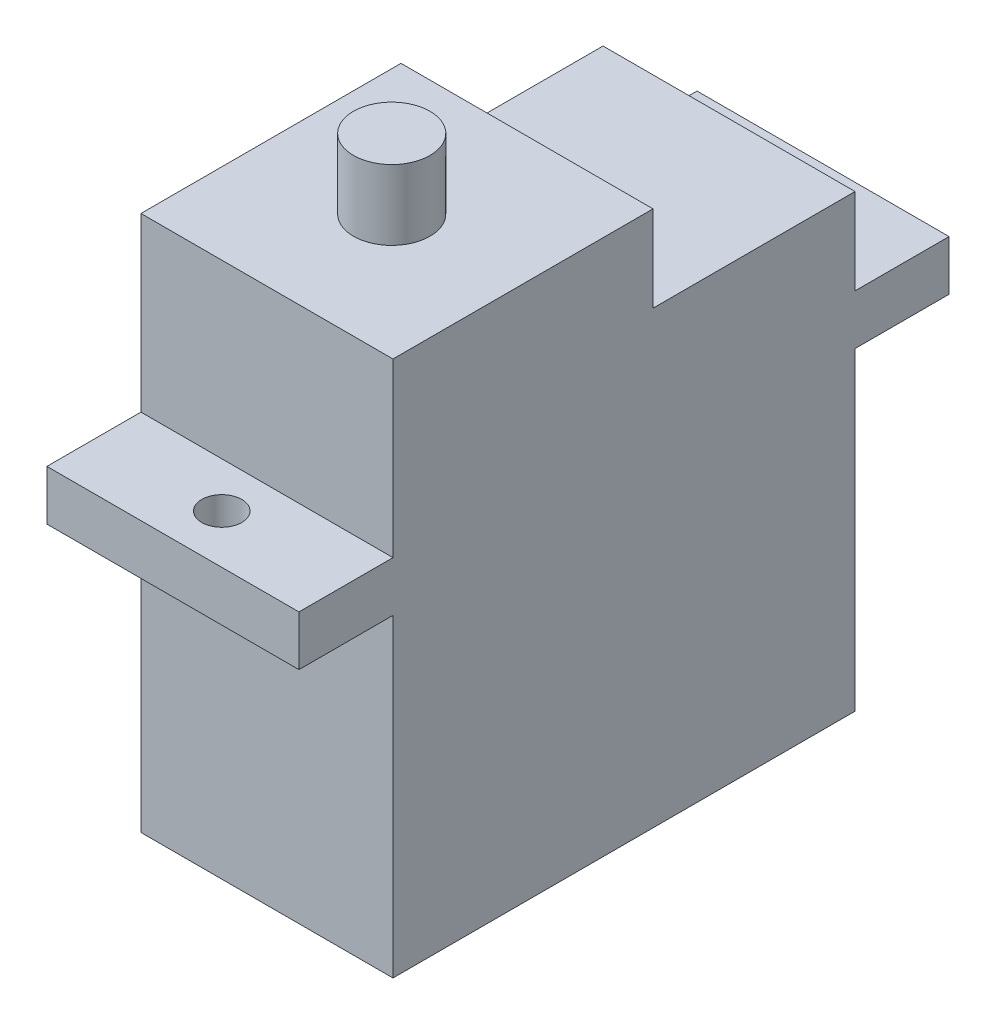
ISO-10303-21;
HEADER;
FILE_DESCRIPTION(('STEP AP214'),'2;1');
FILE_NAME('part.step','',(''),(''),'','','');
FILE_SCHEMA(('AUTOMOTIVE_DESIGN { 1 0 10303 214 1 1 1 1 }'));
ENDSEC;
DATA;
#1=APPLICATION_CONTEXT('core data for automotive mechanical design processes');
#2=APPLICATION_PROTOCOL_DEFINITION('international standard','automotive_design',2000,#1);
#3=PRODUCT_CONTEXT('',#1,'mechanical');
#4=PRODUCT('Part','Part','',(#3));
#5=PRODUCT_RELATED_PRODUCT_CATEGORY('part','',(#4));
#6=PRODUCT_DEFINITION_FORMATION('','',#4);
#7=PRODUCT_DEFINITION_CONTEXT('part definition',#1,'design');
#8=PRODUCT_DEFINITION('design','',#6,#7);
#9=PRODUCT_DEFINITION_SHAPE('','',#8);
#10=(LENGTH_UNIT() NAMED_UNIT(*) SI_UNIT(.MILLI.,.METRE.));
#11=(NAMED_UNIT(*) PLANE_ANGLE_UNIT() SI_UNIT($,.RADIAN.));
#12=(NAMED_UNIT(*) SI_UNIT($,.STERADIAN.) SOLID_ANGLE_UNIT());
#13=UNCERTAINTY_MEASURE_WITH_UNIT(LENGTH_MEASURE(1.E-05),#10,'distance_accuracy_value','');
#14=(GEOMETRIC_REPRESENTATION_CONTEXT(3) GLOBAL_UNCERTAINTY_ASSIGNED_CONTEXT((#13)) GLOBAL_UNIT_ASSIGNED_CONTEXT((#10,
#11,#12)) REPRESENTATION_CONTEXT('',''));
#15=CARTESIAN_POINT('',(0.,0.,0.));
#16=DIRECTION('',(0.,0.,1.));
#17=DIRECTION('',(1.,0.,0.));
#18=AXIS2_PLACEMENT_3D('',#15,#16,#17);
#19=CARTESIAN_POINT('',(0.,18.2,0.));
#20=DIRECTION('',(0.,1.,0.));
#21=DIRECTION('',(0.,0.,1.));
#22=AXIS2_PLACEMENT_3D('',#19,#20,#21);
#23=PLANE('',#22);
#24=CARTESIAN_POINT('',(0.,18.2,13.81));
#25=DIRECTION('',(0.,1.,0.));
#26=DIRECTION('',(0.,0.,-1.));
#27=AXIS2_PLACEMENT_3D('',#24,#25,#26);
#28=CIRCLE('',#27,0.999999999999997);
#29=CARTESIAN_POINT('',(0.,18.2,14.81));
#30=VERTEX_POINT('',#29);
#31=EDGE_CURVE('E284',#30,#30,#28,.T.);
#32=ORIENTED_EDGE('',*,*,#31,.F.);
#33=EDGE_LOOP('',(#32));
#34=FACE_BOUND('',#33,.T.);
#35=DIRECTION('',(1.,0.,0.));
#36=VECTOR('',#35,1.);
#37=CARTESIAN_POINT('',(-6.3,18.2,11.55));
#38=LINE('',#37,#36);
#39=CARTESIAN_POINT('',(-6.3,18.2,11.55));
#40=VERTEX_POINT('',#39);
#41=CARTESIAN_POINT('',(6.3,18.2,11.55));
#42=VERTEX_POINT('',#41);
#43=EDGE_CURVE('E61',#40,#42,#38,.T.);
#44=ORIENTED_EDGE('',*,*,#43,.F.);
#45=DIRECTION('',(0.,0.,1.));
#46=VECTOR('',#45,1.);
#47=CARTESIAN_POINT('',(-6.3,18.2,-16.25));
#48=LINE('',#47,#46);
#49=CARTESIAN_POINT('',(-6.3,18.2,16.25));
#50=VERTEX_POINT('',#49);
#51=EDGE_CURVE('E193',#40,#50,#48,.T.);
#52=ORIENTED_EDGE('',*,*,#51,.T.);
#53=DIRECTION('',(1.,0.,0.));
#54=VECTOR('',#53,1.);
#55=CARTESIAN_POINT('',(-6.3,18.2,16.25));
#56=LINE('',#55,#54);
#57=CARTESIAN_POINT('',(6.3,18.2,16.25));
#58=VERTEX_POINT('',#57);
#59=EDGE_CURVE('E196',#50,#58,#56,.T.);
#60=ORIENTED_EDGE('',*,*,#59,.T.);
#61=DIRECTION('',(0.,0.,-1.));
#62=VECTOR('',#61,1.);
#63=CARTESIAN_POINT('',(6.3,18.2,-16.25));
#64=LINE('',#63,#62);
#65=EDGE_CURVE('E188',#58,#42,#64,.T.);
#66=ORIENTED_EDGE('',*,*,#65,.T.);
#67=EDGE_LOOP('',(#44,#52,#60,#66));
#68=FACE_BOUND('',#67,.T.);
#69=ADVANCED_FACE('F36',(#34,#68),#23,.T.);
#70=CARTESIAN_POINT('',(6.3,15.7,-11.55));
#71=DIRECTION('',(-1.,0.,0.));
#72=DIRECTION('',(0.,0.,1.));
#73=AXIS2_PLACEMENT_3D('',#70,#71,#72);
#74=PLANE('',#73);
#75=DIRECTION('',(0.,0.,-1.));
#76=VECTOR('',#75,1.);
#77=CARTESIAN_POINT('',(6.3,0.,-11.55));
#78=LINE('',#77,#76);
#79=CARTESIAN_POINT('',(6.3,0.,11.55));
#80=VERTEX_POINT('',#79);
#81=CARTESIAN_POINT('',(6.3,0.,-11.55));
#82=VERTEX_POINT('',#81);
#83=EDGE_CURVE('E221',#80,#82,#78,.T.);
#84=ORIENTED_EDGE('',*,*,#83,.T.);
#85=DIRECTION('',(0.,-1.,0.));
#86=VECTOR('',#85,1.);
#87=CARTESIAN_POINT('',(6.3,15.7,-11.55));
#88=LINE('',#87,#86);
#89=CARTESIAN_POINT('',(6.3,15.7,-11.55));
#90=VERTEX_POINT('',#89);
#91=EDGE_CURVE('E45',#90,#82,#88,.T.);
#92=ORIENTED_EDGE('',*,*,#91,.F.);
#93=DIRECTION('',(0.,0.,-1.));
#94=VECTOR('',#93,1.);
#95=CARTESIAN_POINT('',(6.3,15.7,-16.25));
#96=LINE('',#95,#94);
#97=CARTESIAN_POINT('',(6.3,15.7,-16.25));
#98=VERTEX_POINT('',#97);
#99=EDGE_CURVE('E187',#90,#98,#96,.T.);
#100=ORIENTED_EDGE('',*,*,#99,.T.);
#101=DIRECTION('',(0.,-1.,0.));
#102=VECTOR('',#101,1.);
#103=CARTESIAN_POINT('',(6.3,18.2,-16.25));
#104=LINE('',#103,#102);
#105=CARTESIAN_POINT('',(6.3,18.2,-16.25));
#106=VERTEX_POINT('',#105);
#107=EDGE_CURVE('E218',#106,#98,#104,.T.);
#108=ORIENTED_EDGE('',*,*,#107,.F.);
#109=CARTESIAN_POINT('',(6.3,18.2,-11.55));
#110=VERTEX_POINT('',#109);
#111=EDGE_CURVE('E191',#110,#106,#64,.T.);
#112=ORIENTED_EDGE('',*,*,#111,.F.);
#113=DIRECTION('',(0.,-1.,0.));
#114=VECTOR('',#113,1.);
#115=CARTESIAN_POINT('',(6.3,22.5,-11.55));
#116=LINE('',#115,#114);
#117=CARTESIAN_POINT('',(6.3,22.5,-11.55));
#118=VERTEX_POINT('',#117);
#119=EDGE_CURVE('E184',#118,#110,#116,.T.);
#120=ORIENTED_EDGE('',*,*,#119,.F.);
#121=DIRECTION('',(0.,0.,-1.));
#122=VECTOR('',#121,1.);
#123=CARTESIAN_POINT('',(6.3,22.5,-11.55));
#124=LINE('',#123,#122);
#125=CARTESIAN_POINT('',(6.3,22.5,-1.45000000000001));
#126=VERTEX_POINT('',#125);
#127=EDGE_CURVE('E162',#126,#118,#124,.T.);
#128=ORIENTED_EDGE('',*,*,#127,.F.);
#129=DIRECTION('',(0.,-1.,0.));
#130=VECTOR('',#129,1.);
#131=CARTESIAN_POINT('',(6.3,26.8,-1.45000000000001));
#132=LINE('',#131,#130);
#133=CARTESIAN_POINT('',(6.3,26.8,-1.45000000000001));
#134=VERTEX_POINT('',#133);
#135=EDGE_CURVE('E143',#134,#126,#132,.T.);
#136=ORIENTED_EDGE('',*,*,#135,.F.);
#137=DIRECTION('',(0.,0.,-1.));
#138=VECTOR('',#137,1.);
#139=CARTESIAN_POINT('',(6.3,26.8,11.55));
#140=LINE('',#139,#138);
#141=CARTESIAN_POINT('',(6.3,26.8,11.55));
#142=VERTEX_POINT('',#141);
#143=EDGE_CURVE('E150',#142,#134,#140,.T.);
#144=ORIENTED_EDGE('',*,*,#143,.F.);
#145=DIRECTION('',(0.,-1.,0.));
#146=VECTOR('',#145,1.);
#147=CARTESIAN_POINT('',(6.3,22.5,11.55));
#148=LINE('',#147,#146);
#149=EDGE_CURVE('E174',#142,#42,#148,.T.);
#150=ORIENTED_EDGE('',*,*,#149,.T.);
#151=ORIENTED_EDGE('',*,*,#65,.F.);
#152=DIRECTION('',(0.,-1.,0.));
#153=VECTOR('',#152,1.);
#154=CARTESIAN_POINT('',(6.3,18.2,16.25));
#155=LINE('',#154,#153);
#156=CARTESIAN_POINT('',(6.3,15.7,16.25));
#157=VERTEX_POINT('',#156);
#158=EDGE_CURVE('E198',#58,#157,#155,.T.);
#159=ORIENTED_EDGE('',*,*,#158,.T.);
#160=CARTESIAN_POINT('',(6.3,15.7,11.55));
#161=VERTEX_POINT('',#160);
#162=EDGE_CURVE('E199',#157,#161,#96,.T.);
#163=ORIENTED_EDGE('',*,*,#162,.T.);
#164=DIRECTION('',(0.,-1.,0.));
#165=VECTOR('',#164,1.);
#166=CARTESIAN_POINT('',(6.3,15.7,11.55));
#167=LINE('',#166,#165);
#168=EDGE_CURVE('E229',#161,#80,#167,.T.);
#169=ORIENTED_EDGE('',*,*,#168,.T.);
#170=EDGE_LOOP('',(#84,#92,#100,#108,#112,#120,#128,#136,#144,#150,#151,#159,#163,#169));
#171=FACE_BOUND('',#170,.T.);
#172=ADVANCED_FACE('F38',(#171),#74,.F.);
#173=CARTESIAN_POINT('',(-6.3,15.7,-11.55));
#174=DIRECTION('',(0.,0.,1.));
#175=DIRECTION('',(1.,0.,0.));
#176=AXIS2_PLACEMENT_3D('',#173,#174,#175);
#177=PLANE('',#176);
#178=DIRECTION('',(-1.,0.,0.));
#179=VECTOR('',#178,1.);
#180=CARTESIAN_POINT('',(-6.3,0.,-11.55));
#181=LINE('',#180,#179);
#182=CARTESIAN_POINT('',(-6.3,0.,-11.55));
#183=VERTEX_POINT('',#182);
#184=EDGE_CURVE('E231',#82,#183,#181,.T.);
#185=ORIENTED_EDGE('',*,*,#184,.T.);
#186=DIRECTION('',(0.,-1.,0.));
#187=VECTOR('',#186,1.);
#188=CARTESIAN_POINT('',(-6.3,15.7,-11.55));
#189=LINE('',#188,#187);
#190=CARTESIAN_POINT('',(-6.3,15.7,-11.55));
#191=VERTEX_POINT('',#190);
#192=EDGE_CURVE('E241',#191,#183,#189,.T.);
#193=ORIENTED_EDGE('',*,*,#192,.F.);
#194=DIRECTION('',(-1.,0.,0.));
#195=VECTOR('',#194,1.);
#196=CARTESIAN_POINT('',(-6.3,15.7,-11.55));
#197=LINE('',#196,#195);
#198=EDGE_CURVE('E222',#90,#191,#197,.T.);
#199=ORIENTED_EDGE('',*,*,#198,.F.);
#200=ORIENTED_EDGE('',*,*,#91,.T.);
#201=EDGE_LOOP('',(#185,#193,#199,#200));
#202=FACE_BOUND('',#201,.T.);
#203=ADVANCED_FACE('F246',(#202),#177,.F.);
#204=CARTESIAN_POINT('',(-6.3,15.7,-11.55));
#205=DIRECTION('',(1.,0.,0.));
#206=DIRECTION('',(0.,0.,-1.));
#207=AXIS2_PLACEMENT_3D('',#204,#205,#206);
#208=PLANE('',#207);
#209=DIRECTION('',(0.,0.,1.));
#210=VECTOR('',#209,1.);
#211=CARTESIAN_POINT('',(-6.3,0.,-11.55));
#212=LINE('',#211,#210);
#213=CARTESIAN_POINT('',(-6.3,0.,11.55));
#214=VERTEX_POINT('',#213);
#215=EDGE_CURVE('E233',#183,#214,#212,.T.);
#216=ORIENTED_EDGE('',*,*,#215,.T.);
#217=DIRECTION('',(0.,-1.,0.));
#218=VECTOR('',#217,1.);
#219=CARTESIAN_POINT('',(-6.3,15.7,11.55));
#220=LINE('',#219,#218);
#221=CARTESIAN_POINT('',(-6.3,15.7,11.55));
#222=VERTEX_POINT('',#221);
#223=EDGE_CURVE('E238',#222,#214,#220,.T.);
#224=ORIENTED_EDGE('',*,*,#223,.F.);
#225=DIRECTION('',(0.,0.,1.));
#226=VECTOR('',#225,1.);
#227=CARTESIAN_POINT('',(-6.3,15.7,-16.25));
#228=LINE('',#227,#226);
#229=CARTESIAN_POINT('',(-6.3,15.7,16.25));
#230=VERTEX_POINT('',#229);
#231=EDGE_CURVE('E204',#222,#230,#228,.T.);
#232=ORIENTED_EDGE('',*,*,#231,.T.);
#233=DIRECTION('',(0.,-1.,0.));
#234=VECTOR('',#233,1.);
#235=CARTESIAN_POINT('',(-6.3,18.2,16.25));
#236=LINE('',#235,#234);
#237=EDGE_CURVE('E212',#50,#230,#236,.T.);
#238=ORIENTED_EDGE('',*,*,#237,.F.);
#239=ORIENTED_EDGE('',*,*,#51,.F.);
#240=DIRECTION('',(0.,-1.,0.));
#241=VECTOR('',#240,1.);
#242=CARTESIAN_POINT('',(-6.3,22.5,11.55));
#243=LINE('',#242,#241);
#244=CARTESIAN_POINT('',(-6.3,26.8,11.55));
#245=VERTEX_POINT('',#244);
#246=EDGE_CURVE('E178',#245,#40,#243,.T.);
#247=ORIENTED_EDGE('',*,*,#246,.F.);
#248=DIRECTION('',(0.,0.,-1.));
#249=VECTOR('',#248,1.);
#250=CARTESIAN_POINT('',(-6.3,26.8,11.55));
#251=LINE('',#250,#249);
#252=CARTESIAN_POINT('',(-6.3,26.8,-1.45));
#253=VERTEX_POINT('',#252);
#254=EDGE_CURVE('E149',#245,#253,#251,.T.);
#255=ORIENTED_EDGE('',*,*,#254,.T.);
#256=DIRECTION('',(0.,-1.,0.));
#257=VECTOR('',#256,1.);
#258=CARTESIAN_POINT('',(-6.3,26.8,-1.45));
#259=LINE('',#258,#257);
#260=CARTESIAN_POINT('',(-6.3,22.5,-1.45));
#261=VERTEX_POINT('',#260);
#262=EDGE_CURVE('E145',#253,#261,#259,.T.);
#263=ORIENTED_EDGE('',*,*,#262,.T.);
#264=DIRECTION('',(0.,0.,1.));
#265=VECTOR('',#264,1.);
#266=CARTESIAN_POINT('',(-6.3,22.5,-11.55));
#267=LINE('',#266,#265);
#268=CARTESIAN_POINT('',(-6.3,22.5,-11.55));
#269=VERTEX_POINT('',#268);
#270=EDGE_CURVE('E173',#269,#261,#267,.T.);
#271=ORIENTED_EDGE('',*,*,#270,.F.);
#272=DIRECTION('',(0.,-1.,0.));
#273=VECTOR('',#272,1.);
#274=CARTESIAN_POINT('',(-6.3,22.5,-11.55));
#275=LINE('',#274,#273);
#276=CARTESIAN_POINT('',(-6.3,18.2,-11.55));
#277=VERTEX_POINT('',#276);
#278=EDGE_CURVE('E181',#269,#277,#275,.T.);
#279=ORIENTED_EDGE('',*,*,#278,.T.);
#280=CARTESIAN_POINT('',(-6.3,18.2,-16.25));
#281=VERTEX_POINT('',#280);
#282=EDGE_CURVE('E194',#281,#277,#48,.T.);
#283=ORIENTED_EDGE('',*,*,#282,.F.);
#284=DIRECTION('',(0.,-1.,0.));
#285=VECTOR('',#284,1.);
#286=CARTESIAN_POINT('',(-6.3,18.2,-16.25));
#287=LINE('',#286,#285);
#288=CARTESIAN_POINT('',(-6.3,15.7,-16.25));
#289=VERTEX_POINT('',#288);
#290=EDGE_CURVE('E215',#281,#289,#287,.T.);
#291=ORIENTED_EDGE('',*,*,#290,.T.);
#292=EDGE_CURVE('E205',#289,#191,#228,.T.);
#293=ORIENTED_EDGE('',*,*,#292,.T.);
#294=ORIENTED_EDGE('',*,*,#192,.T.);
#295=EDGE_LOOP('',(#216,#224,#232,#238,#239,#247,#255,#263,#271,#279,#283,#291,#293,#294));
#296=FACE_BOUND('',#295,.T.);
#297=ADVANCED_FACE('F254',(#296),#208,.F.);
#298=CARTESIAN_POINT('',(-6.3,15.7,11.55));
#299=DIRECTION('',(0.,0.,-1.));
#300=DIRECTION('',(-1.,0.,0.));
#301=AXIS2_PLACEMENT_3D('',#298,#299,#300);
#302=PLANE('',#301);
#303=DIRECTION('',(1.,0.,0.));
#304=VECTOR('',#303,1.);
#305=CARTESIAN_POINT('',(-6.3,0.,11.55));
#306=LINE('',#305,#304);
#307=EDGE_CURVE('E226',#214,#80,#306,.T.);
#308=ORIENTED_EDGE('',*,*,#307,.T.);
#309=ORIENTED_EDGE('',*,*,#168,.F.);
#310=DIRECTION('',(1.,0.,0.));
#311=VECTOR('',#310,1.);
#312=CARTESIAN_POINT('',(-6.3,15.7,11.55));
#313=LINE('',#312,#311);
#314=EDGE_CURVE('E225',#222,#161,#313,.T.);
#315=ORIENTED_EDGE('',*,*,#314,.F.);
#316=ORIENTED_EDGE('',*,*,#223,.T.);
#317=EDGE_LOOP('',(#308,#309,#315,#316));
#318=FACE_BOUND('',#317,.T.);
#319=ADVANCED_FACE('F257',(#318),#302,.F.);
#320=CARTESIAN_POINT('',(0.,0.,0.));
#321=DIRECTION('',(0.,1.,0.));
#322=DIRECTION('',(0.,0.,1.));
#323=AXIS2_PLACEMENT_3D('',#320,#321,#322);
#324=PLANE('',#323);
#325=ORIENTED_EDGE('',*,*,#83,.F.);
#326=ORIENTED_EDGE('',*,*,#307,.F.);
#327=ORIENTED_EDGE('',*,*,#215,.F.);
#328=ORIENTED_EDGE('',*,*,#184,.F.);
#329=EDGE_LOOP('',(#325,#326,#327,#328));
#330=FACE_BOUND('',#329,.T.);
#331=ADVANCED_FACE('F251',(#330),#324,.F.);
#332=CARTESIAN_POINT('',(0.,15.7,0.));
#333=DIRECTION('',(0.,1.,0.));
#334=DIRECTION('',(0.,0.,1.));
#335=AXIS2_PLACEMENT_3D('',#332,#333,#334);
#336=PLANE('',#335);
#337=CARTESIAN_POINT('',(0.,15.7,-13.81));
#338=DIRECTION('',(0.,1.,0.));
#339=DIRECTION('',(0.,0.,1.));
#340=AXIS2_PLACEMENT_3D('',#337,#338,#339);
#341=CIRCLE('',#340,1.);
#342=CARTESIAN_POINT('',(0.,15.7,-12.81));
#343=VERTEX_POINT('',#342);
#344=EDGE_CURVE('E279',#343,#343,#341,.T.);
#345=ORIENTED_EDGE('',*,*,#344,.T.);
#346=EDGE_LOOP('',(#345));
#347=FACE_BOUND('',#346,.T.);
#348=ORIENTED_EDGE('',*,*,#99,.F.);
#349=ORIENTED_EDGE('',*,*,#198,.T.);
#350=ORIENTED_EDGE('',*,*,#292,.F.);
#351=DIRECTION('',(-1.,0.,0.));
#352=VECTOR('',#351,1.);
#353=CARTESIAN_POINT('',(-6.3,15.7,-16.25));
#354=LINE('',#353,#352);
#355=EDGE_CURVE('E202',#98,#289,#354,.T.);
#356=ORIENTED_EDGE('',*,*,#355,.F.);
#357=EDGE_LOOP('',(#348,#349,#350,#356));
#358=FACE_BOUND('',#357,.T.);
#359=ADVANCED_FACE('F312',(#347,#358),#336,.F.);
#360=CARTESIAN_POINT('',(0.,15.7,13.81));
#361=DIRECTION('',(0.,1.,0.));
#362=DIRECTION('',(0.,0.,1.));
#363=AXIS2_PLACEMENT_3D('',#360,#361,#362);
#364=CIRCLE('',#363,0.999999999999997);
#365=CARTESIAN_POINT('',(0.,15.7,14.81));
#366=VERTEX_POINT('',#365);
#367=EDGE_CURVE('E40',#366,#366,#364,.T.);
#368=ORIENTED_EDGE('',*,*,#367,.T.);
#369=EDGE_LOOP('',(#368));
#370=FACE_BOUND('',#369,.T.);
#371=ORIENTED_EDGE('',*,*,#231,.F.);
#372=ORIENTED_EDGE('',*,*,#314,.T.);
#373=ORIENTED_EDGE('',*,*,#162,.F.);
#374=DIRECTION('',(1.,0.,0.));
#375=VECTOR('',#374,1.);
#376=CARTESIAN_POINT('',(-6.3,15.7,16.25));
#377=LINE('',#376,#375);
#378=EDGE_CURVE('E208',#230,#157,#377,.T.);
#379=ORIENTED_EDGE('',*,*,#378,.F.);
#380=EDGE_LOOP('',(#371,#372,#373,#379));
#381=FACE_BOUND('',#380,.T.);
#382=ADVANCED_FACE('F262',(#370,#381),#336,.F.);
#383=CARTESIAN_POINT('',(-6.3,18.2,-16.25));
#384=DIRECTION('',(0.,0.,1.));
#385=DIRECTION('',(1.,0.,0.));
#386=AXIS2_PLACEMENT_3D('',#383,#384,#385);
#387=PLANE('',#386);
#388=ORIENTED_EDGE('',*,*,#355,.T.);
#389=ORIENTED_EDGE('',*,*,#290,.F.);
#390=DIRECTION('',(-1.,0.,0.));
#391=VECTOR('',#390,1.);
#392=CARTESIAN_POINT('',(-6.3,18.2,-16.25));
#393=LINE('',#392,#391);
#394=EDGE_CURVE('E190',#106,#281,#393,.T.);
#395=ORIENTED_EDGE('',*,*,#394,.F.);
#396=ORIENTED_EDGE('',*,*,#107,.T.);
#397=EDGE_LOOP('',(#388,#389,#395,#396));
#398=FACE_BOUND('',#397,.T.);
#399=ADVANCED_FACE('F313',(#398),#387,.F.);
#400=CARTESIAN_POINT('',(-6.3,18.2,16.25));
#401=DIRECTION('',(0.,0.,-1.));
#402=DIRECTION('',(-1.,0.,0.));
#403=AXIS2_PLACEMENT_3D('',#400,#401,#402);
#404=PLANE('',#403);
#405=ORIENTED_EDGE('',*,*,#378,.T.);
#406=ORIENTED_EDGE('',*,*,#158,.F.);
#407=ORIENTED_EDGE('',*,*,#59,.F.);
#408=ORIENTED_EDGE('',*,*,#237,.T.);
#409=EDGE_LOOP('',(#405,#406,#407,#408));
#410=FACE_BOUND('',#409,.T.);
#411=ADVANCED_FACE('F266',(#410),#404,.F.);
#412=CARTESIAN_POINT('',(0.,18.2,-13.81));
#413=DIRECTION('',(0.,1.,0.));
#414=DIRECTION('',(0.,0.,1.));
#415=AXIS2_PLACEMENT_3D('',#412,#413,#414);
#416=CIRCLE('',#415,1.);
#417=CARTESIAN_POINT('',(0.,18.2,-12.81));
#418=VERTEX_POINT('',#417);
#419=EDGE_CURVE('E283',#418,#418,#416,.T.);
#420=ORIENTED_EDGE('',*,*,#419,.F.);
#421=EDGE_LOOP('',(#420));
#422=FACE_BOUND('',#421,.T.);
#423=DIRECTION('',(-1.,0.,0.));
#424=VECTOR('',#423,1.);
#425=CARTESIAN_POINT('',(-6.3,18.2,-11.55));
#426=LINE('',#425,#424);
#427=EDGE_CURVE('E163',#110,#277,#426,.T.);
#428=ORIENTED_EDGE('',*,*,#427,.F.);
#429=ORIENTED_EDGE('',*,*,#111,.T.);
#430=ORIENTED_EDGE('',*,*,#394,.T.);
#431=ORIENTED_EDGE('',*,*,#282,.T.);
#432=EDGE_LOOP('',(#428,#429,#430,#431));
#433=FACE_BOUND('',#432,.T.);
#434=ADVANCED_FACE('F293',(#422,#433),#23,.T.);
#435=CARTESIAN_POINT('',(-6.3,22.5,-11.55));
#436=DIRECTION('',(0.,0.,1.));
#437=DIRECTION('',(1.,0.,0.));
#438=AXIS2_PLACEMENT_3D('',#435,#436,#437);
#439=PLANE('',#438);
#440=ORIENTED_EDGE('',*,*,#427,.T.);
#441=ORIENTED_EDGE('',*,*,#278,.F.);
#442=DIRECTION('',(-1.,0.,0.));
#443=VECTOR('',#442,1.);
#444=CARTESIAN_POINT('',(-6.3,22.5,-11.55));
#445=LINE('',#444,#443);
#446=EDGE_CURVE('E171',#118,#269,#445,.T.);
#447=ORIENTED_EDGE('',*,*,#446,.F.);
#448=ORIENTED_EDGE('',*,*,#119,.T.);
#449=EDGE_LOOP('',(#440,#441,#447,#448));
#450=FACE_BOUND('',#449,.T.);
#451=ADVANCED_FACE('F296',(#450),#439,.F.);
#452=CARTESIAN_POINT('',(-6.3,22.5,11.55));
#453=DIRECTION('',(0.,0.,-1.));
#454=DIRECTION('',(-1.,0.,0.));
#455=AXIS2_PLACEMENT_3D('',#452,#453,#454);
#456=PLANE('',#455);
#457=ORIENTED_EDGE('',*,*,#43,.T.);
#458=ORIENTED_EDGE('',*,*,#149,.F.);
#459=DIRECTION('',(-1.,0.,0.));
#460=VECTOR('',#459,1.);
#461=CARTESIAN_POINT('',(6.3,26.8,11.55));
#462=LINE('',#461,#460);
#463=EDGE_CURVE('E156',#142,#245,#462,.T.);
#464=ORIENTED_EDGE('',*,*,#463,.T.);
#465=ORIENTED_EDGE('',*,*,#246,.T.);
#466=EDGE_LOOP('',(#457,#458,#464,#465));
#467=FACE_BOUND('',#466,.T.);
#468=ADVANCED_FACE('F270',(#467),#456,.F.);
#469=CARTESIAN_POINT('',(0.,22.5,0.));
#470=DIRECTION('',(0.,1.,0.));
#471=DIRECTION('',(0.,0.,1.));
#472=AXIS2_PLACEMENT_3D('',#469,#470,#471);
#473=PLANE('',#472);
#474=DIRECTION('',(-1.,0.,0.));
#475=VECTOR('',#474,1.);
#476=CARTESIAN_POINT('',(6.3,22.5,-1.45000000000001));
#477=LINE('',#476,#475);
#478=EDGE_CURVE('E53',#126,#261,#477,.T.);
#479=ORIENTED_EDGE('',*,*,#478,.F.);
#480=ORIENTED_EDGE('',*,*,#127,.T.);
#481=ORIENTED_EDGE('',*,*,#446,.T.);
#482=ORIENTED_EDGE('',*,*,#270,.T.);
#483=EDGE_LOOP('',(#479,#480,#481,#482));
#484=FACE_BOUND('',#483,.T.);
#485=ADVANCED_FACE('F306',(#484),#473,.T.);
#486=CARTESIAN_POINT('',(6.3,26.8,-1.45000000000001));
#487=DIRECTION('',(0.,0.,1.));
#488=DIRECTION('',(1.,0.,0.));
#489=AXIS2_PLACEMENT_3D('',#486,#487,#488);
#490=PLANE('',#489);
#491=ORIENTED_EDGE('',*,*,#478,.T.);
#492=ORIENTED_EDGE('',*,*,#262,.F.);
#493=DIRECTION('',(-1.,0.,0.));
#494=VECTOR('',#493,1.);
#495=CARTESIAN_POINT('',(6.3,26.8,-1.45000000000001));
#496=LINE('',#495,#494);
#497=EDGE_CURVE('E139',#134,#253,#496,.T.);
#498=ORIENTED_EDGE('',*,*,#497,.F.);
#499=ORIENTED_EDGE('',*,*,#135,.T.);
#500=EDGE_LOOP('',(#491,#492,#498,#499));
#501=FACE_BOUND('',#500,.T.);
#502=ADVANCED_FACE('F141',(#501),#490,.F.);
#503=CARTESIAN_POINT('',(0.,26.8,0.));
#504=DIRECTION('',(0.,1.,0.));
#505=DIRECTION('',(0.,0.,1.));
#506=AXIS2_PLACEMENT_3D('',#503,#504,#505);
#507=PLANE('',#506);
#508=CARTESIAN_POINT('',(0.,26.8,5.31293863452413));
#509=DIRECTION('',(0.,1.,0.));
#510=DIRECTION('',(0.,0.,1.));
#511=AXIS2_PLACEMENT_3D('',#508,#509,#510);
#512=CIRCLE('',#511,1.91287793386519);
#513=CARTESIAN_POINT('',(0.,26.8,3.40006070065894));
#514=VERTEX_POINT('',#513);
#515=EDGE_CURVE('E11',#514,#514,#512,.T.);
#516=ORIENTED_EDGE('',*,*,#515,.F.);
#517=EDGE_LOOP('',(#516));
#518=FACE_BOUND('',#517,.T.);
#519=ORIENTED_EDGE('',*,*,#143,.T.);
#520=ORIENTED_EDGE('',*,*,#497,.T.);
#521=ORIENTED_EDGE('',*,*,#254,.F.);
#522=ORIENTED_EDGE('',*,*,#463,.F.);
#523=EDGE_LOOP('',(#519,#520,#521,#522));
#524=FACE_BOUND('',#523,.T.);
#525=ADVANCED_FACE('F154',(#518,#524),#507,.T.);
#526=CARTESIAN_POINT('',(0.,30.3,5.31293863452413));
#527=DIRECTION('',(0.,-1.,0.));
#528=DIRECTION('',(0.,0.,-1.));
#529=AXIS2_PLACEMENT_3D('',#526,#527,#528);
#530=CYLINDRICAL_SURFACE('',#529,1.91287793386519);
#531=CARTESIAN_POINT('',(0.,30.3,5.31293863452413));
#532=DIRECTION('',(0.,1.,0.));
#533=DIRECTION('',(0.,0.,1.));
#534=AXIS2_PLACEMENT_3D('',#531,#532,#533);
#535=CIRCLE('',#534,1.91287793386519);
#536=CARTESIAN_POINT('',(0.,30.3,3.40006070065894));
#537=VERTEX_POINT('',#536);
#538=EDGE_CURVE('E273',#537,#537,#535,.T.);
#539=CARTESIAN_POINT('',(0.,30.3,3.40006070065894));
#540=CARTESIAN_POINT('',(0.,30.2635416666667,3.40006070065894));
#541=CARTESIAN_POINT('',(0.,30.2270833333333,3.40006070065894));
#542=CARTESIAN_POINT('',(0.,30.1541666666667,3.40006070065894));
#543=CARTESIAN_POINT('',(0.,30.1177083333333,3.40006070065894));
#544=CARTESIAN_POINT('',(0.,30.0447916666667,3.40006070065894));
#545=CARTESIAN_POINT('',(0.,30.0083333333333,3.40006070065894));
#546=CARTESIAN_POINT('',(0.,29.9354166666667,3.40006070065894));
#547=CARTESIAN_POINT('',(0.,29.8989583333333,3.40006070065894));
#548=CARTESIAN_POINT('',(0.,29.8260416666667,3.40006070065894));
#549=CARTESIAN_POINT('',(0.,29.7895833333333,3.40006070065894));
#550=CARTESIAN_POINT('',(0.,29.7166666666667,3.40006070065894));
#551=CARTESIAN_POINT('',(0.,29.6802083333333,3.40006070065894));
#552=CARTESIAN_POINT('',(0.,29.6072916666667,3.40006070065894));
#553=CARTESIAN_POINT('',(0.,29.5708333333333,3.40006070065894));
#554=CARTESIAN_POINT('',(0.,29.4979166666667,3.40006070065894));
#555=CARTESIAN_POINT('',(0.,29.4614583333333,3.40006070065894));
#556=CARTESIAN_POINT('',(0.,29.3885416666667,3.40006070065894));
#557=CARTESIAN_POINT('',(0.,29.3520833333333,3.40006070065894));
#558=CARTESIAN_POINT('',(0.,29.2791666666667,3.40006070065894));
#559=CARTESIAN_POINT('',(0.,29.2427083333333,3.40006070065894));
#560=CARTESIAN_POINT('',(0.,29.1697916666667,3.40006070065894));
#561=CARTESIAN_POINT('',(0.,29.1333333333333,3.40006070065894));
#562=CARTESIAN_POINT('',(0.,29.0604166666667,3.40006070065894));
#563=CARTESIAN_POINT('',(0.,29.0239583333333,3.40006070065894));
#564=CARTESIAN_POINT('',(0.,28.9510416666667,3.40006070065894));
#565=CARTESIAN_POINT('',(0.,28.9145833333333,3.40006070065894));
#566=CARTESIAN_POINT('',(0.,28.8416666666667,3.40006070065894));
#567=CARTESIAN_POINT('',(0.,28.8052083333333,3.40006070065894));
#568=CARTESIAN_POINT('',(0.,28.7322916666667,3.40006070065894));
#569=CARTESIAN_POINT('',(0.,28.6958333333333,3.40006070065894));
#570=CARTESIAN_POINT('',(0.,28.6229166666667,3.40006070065894));
#571=CARTESIAN_POINT('',(0.,28.5864583333333,3.40006070065894));
#572=CARTESIAN_POINT('',(0.,28.5135416666667,3.40006070065894));
#573=CARTESIAN_POINT('',(0.,28.4770833333333,3.40006070065894));
#574=CARTESIAN_POINT('',(0.,28.4041666666667,3.40006070065894));
#575=CARTESIAN_POINT('',(0.,28.3677083333333,3.40006070065894));
#576=CARTESIAN_POINT('',(0.,28.2947916666667,3.40006070065894));
#577=CARTESIAN_POINT('',(0.,28.2583333333333,3.40006070065894));
#578=CARTESIAN_POINT('',(0.,28.1854166666667,3.40006070065894));
#579=CARTESIAN_POINT('',(0.,28.1489583333333,3.40006070065894));
#580=CARTESIAN_POINT('',(0.,28.0760416666667,3.40006070065894));
#581=CARTESIAN_POINT('',(0.,28.0395833333333,3.40006070065894));
#582=CARTESIAN_POINT('',(0.,27.9666666666667,3.40006070065894));
#583=CARTESIAN_POINT('',(0.,27.9302083333333,3.40006070065894));
#584=CARTESIAN_POINT('',(0.,27.8572916666667,3.40006070065894));
#585=CARTESIAN_POINT('',(0.,27.8208333333333,3.40006070065894));
#586=CARTESIAN_POINT('',(0.,27.7479166666667,3.40006070065894));
#587=CARTESIAN_POINT('',(0.,27.7114583333333,3.40006070065894));
#588=CARTESIAN_POINT('',(0.,27.6385416666667,3.40006070065894));
#589=CARTESIAN_POINT('',(0.,27.6020833333333,3.40006070065894));
#590=CARTESIAN_POINT('',(0.,27.5291666666667,3.40006070065894));
#591=CARTESIAN_POINT('',(0.,27.4927083333333,3.40006070065894));
#592=CARTESIAN_POINT('',(0.,27.4197916666667,3.40006070065894));
#593=CARTESIAN_POINT('',(0.,27.3833333333333,3.40006070065894));
#594=CARTESIAN_POINT('',(0.,27.3104166666667,3.40006070065894));
#595=CARTESIAN_POINT('',(0.,27.2739583333333,3.40006070065894));
#596=CARTESIAN_POINT('',(0.,27.2010416666667,3.40006070065894));
#597=CARTESIAN_POINT('',(0.,27.1645833333333,3.40006070065894));
#598=CARTESIAN_POINT('',(0.,27.0916666666667,3.40006070065894));
#599=CARTESIAN_POINT('',(0.,27.0552083333333,3.40006070065894));
#600=CARTESIAN_POINT('',(0.,26.9822916666667,3.40006070065894));
#601=CARTESIAN_POINT('',(0.,26.9458333333333,3.40006070065894));
#602=CARTESIAN_POINT('',(0.,26.8729166666667,3.40006070065894));
#603=CARTESIAN_POINT('',(0.,26.8364583333333,3.40006070065894));
#604=CARTESIAN_POINT('',(0.,26.8,3.40006070065894));
#605=B_SPLINE_CURVE_WITH_KNOTS('',3,(#539,#540,#541,#542,#543,#544,#545,#546,#547,#548,#549,
#550,#551,#552,#553,#554,#555,#556,#557,#558,#559,#560,#561,#562,#563,#564,#565,#566,#567,#568,
#569,#570,#571,#572,#573,#574,#575,#576,#577,#578,#579,#580,#581,#582,#583,#584,#585,#586,#587,
#588,#589,#590,#591,#592,#593,#594,#595,#596,#597,#598,#599,#600,#601,#602,#603,#604),
.UNSPECIFIED.,.F.,.F.,(4,2,2,2,2,2,2,2,2,2,2,2,2,2,2,2,2,2,2,2,2,2,2,2,2,2,2,2,2,2,2,2,4),(0.,
0.109375000000002,0.21875,0.328125000000002,0.4375,0.546875000000002,0.656250000000001,
0.765625000000002,0.875000000000001,0.984375000000003,1.09375,1.203125,1.3125,1.421875,1.53125,
1.640625,1.75,1.859375,1.96875,2.078125,2.1875,2.296875,2.40625,2.515625,2.625,2.734375,2.84375,
2.953125,3.0625,3.171875,3.28125,3.390625,3.5),.UNSPECIFIED.);
#606=EDGE_CURVE('BSEAM348',#537,#514,#605,.T.);
#607=ORIENTED_EDGE('',*,*,#538,.F.);
#608=ORIENTED_EDGE('',*,*,#515,.T.);
#609=ORIENTED_EDGE('',*,*,#606,.T.);
#610=ORIENTED_EDGE('',*,*,#606,.F.);
#611=EDGE_LOOP('',(#607,#609,#608,#610));
#612=FACE_BOUND('',#611,.T.);
#613=ADVANCED_FACE('F348',(#612),#530,.T.);
#614=CARTESIAN_POINT('',(0.,30.3,5.31293863452413));
#615=DIRECTION('',(0.,1.,0.));
#616=DIRECTION('',(0.,0.,1.));
#617=AXIS2_PLACEMENT_3D('',#614,#615,#616);
#618=PLANE('',#617);
#619=ORIENTED_EDGE('',*,*,#538,.T.);
#620=EDGE_LOOP('',(#619));
#621=FACE_BOUND('',#620,.T.);
#622=ADVANCED_FACE('F340',(#621),#618,.T.);
#623=CARTESIAN_POINT('',(0.,14.7,-13.81));
#624=DIRECTION('',(0.,1.,0.));
#625=DIRECTION('',(0.,0.,1.));
#626=AXIS2_PLACEMENT_3D('',#623,#624,#625);
#627=CYLINDRICAL_SURFACE('',#626,1.);
#628=CARTESIAN_POINT('',(0.,18.2,-12.81));
#629=CARTESIAN_POINT('',(0.,18.1739583333333,-12.81));
#630=CARTESIAN_POINT('',(0.,18.1479166666667,-12.81));
#631=CARTESIAN_POINT('',(0.,18.0958333333333,-12.81));
#632=CARTESIAN_POINT('',(0.,18.0697916666667,-12.81));
#633=CARTESIAN_POINT('',(0.,18.0177083333333,-12.81));
#634=CARTESIAN_POINT('',(0.,17.9916666666667,-12.81));
#635=CARTESIAN_POINT('',(0.,17.9395833333333,-12.81));
#636=CARTESIAN_POINT('',(0.,17.9135416666667,-12.81));
#637=CARTESIAN_POINT('',(0.,17.8614583333333,-12.81));
#638=CARTESIAN_POINT('',(0.,17.8354166666667,-12.81));
#639=CARTESIAN_POINT('',(0.,17.7833333333333,-12.81));
#640=CARTESIAN_POINT('',(0.,17.7572916666667,-12.81));
#641=CARTESIAN_POINT('',(0.,17.7052083333333,-12.81));
#642=CARTESIAN_POINT('',(0.,17.6791666666667,-12.81));
#643=CARTESIAN_POINT('',(0.,17.6270833333333,-12.81));
#644=CARTESIAN_POINT('',(0.,17.6010416666667,-12.81));
#645=CARTESIAN_POINT('',(0.,17.5489583333333,-12.81));
#646=CARTESIAN_POINT('',(0.,17.5229166666667,-12.81));
#647=CARTESIAN_POINT('',(0.,17.4708333333333,-12.81));
#648=CARTESIAN_POINT('',(0.,17.4447916666667,-12.81));
#649=CARTESIAN_POINT('',(0.,17.3927083333333,-12.81));
#650=CARTESIAN_POINT('',(0.,17.3666666666667,-12.81));
#651=CARTESIAN_POINT('',(0.,17.3145833333333,-12.81));
#652=CARTESIAN_POINT('',(0.,17.2885416666667,-12.81));
#653=CARTESIAN_POINT('',(0.,17.2364583333333,-12.81));
#654=CARTESIAN_POINT('',(0.,17.2104166666667,-12.81));
#655=CARTESIAN_POINT('',(0.,17.1583333333333,-12.81));
#656=CARTESIAN_POINT('',(0.,17.1322916666667,-12.81));
#657=CARTESIAN_POINT('',(0.,17.0802083333333,-12.81));
#658=CARTESIAN_POINT('',(0.,17.0541666666667,-12.81));
#659=CARTESIAN_POINT('',(0.,17.0020833333333,-12.81));
#660=CARTESIAN_POINT('',(0.,16.9760416666667,-12.81));
#661=CARTESIAN_POINT('',(0.,16.9239583333333,-12.81));
#662=CARTESIAN_POINT('',(0.,16.8979166666667,-12.81));
#663=CARTESIAN_POINT('',(0.,16.8458333333333,-12.81));
#664=CARTESIAN_POINT('',(0.,16.8197916666667,-12.81));
#665=CARTESIAN_POINT('',(0.,16.7677083333333,-12.81));
#666=CARTESIAN_POINT('',(0.,16.7416666666667,-12.81));
#667=CARTESIAN_POINT('',(0.,16.6895833333333,-12.81));
#668=CARTESIAN_POINT('',(0.,16.6635416666667,-12.81));
#669=CARTESIAN_POINT('',(0.,16.6114583333333,-12.81));
#670=CARTESIAN_POINT('',(0.,16.5854166666667,-12.81));
#671=CARTESIAN_POINT('',(0.,16.5333333333333,-12.81));
#672=CARTESIAN_POINT('',(0.,16.5072916666667,-12.81));
#673=CARTESIAN_POINT('',(0.,16.4552083333333,-12.81));
#674=CARTESIAN_POINT('',(0.,16.4291666666667,-12.81));
#675=CARTESIAN_POINT('',(0.,16.3770833333333,-12.81));
#676=CARTESIAN_POINT('',(0.,16.3510416666667,-12.81));
#677=CARTESIAN_POINT('',(0.,16.2989583333333,-12.81));
#678=CARTESIAN_POINT('',(0.,16.2729166666667,-12.81));
#679=CARTESIAN_POINT('',(0.,16.2208333333333,-12.81));
#680=CARTESIAN_POINT('',(0.,16.1947916666667,-12.81));
#681=CARTESIAN_POINT('',(0.,16.1427083333333,-12.81));
#682=CARTESIAN_POINT('',(0.,16.1166666666667,-12.81));
#683=CARTESIAN_POINT('',(0.,16.0645833333333,-12.81));
#684=CARTESIAN_POINT('',(0.,16.0385416666667,-12.81));
#685=CARTESIAN_POINT('',(0.,15.9864583333333,-12.81));
#686=CARTESIAN_POINT('',(0.,15.9604166666667,-12.81));
#687=CARTESIAN_POINT('',(0.,15.9083333333333,-12.81));
#688=CARTESIAN_POINT('',(0.,15.8822916666667,-12.81));
#689=CARTESIAN_POINT('',(0.,15.8302083333333,-12.81));
#690=CARTESIAN_POINT('',(0.,15.8041666666667,-12.81));
#691=CARTESIAN_POINT('',(0.,15.7520833333333,-12.81));
#692=CARTESIAN_POINT('',(0.,15.7260416666667,-12.81));
#693=CARTESIAN_POINT('',(0.,15.7,-12.81));
#694=B_SPLINE_CURVE_WITH_KNOTS('',3,(#628,#629,#630,#631,#632,#633,#634,#635,#636,#637,#638,
#639,#640,#641,#642,#643,#644,#645,#646,#647,#648,#649,#650,#651,#652,#653,#654,#655,#656,#657,
#658,#659,#660,#661,#662,#663,#664,#665,#666,#667,#668,#669,#670,#671,#672,#673,#674,#675,#676,
#677,#678,#679,#680,#681,#682,#683,#684,#685,#686,#687,#688,#689,#690,#691,#692,#693),
.UNSPECIFIED.,.F.,.F.,(4,2,2,2,2,2,2,2,2,2,2,2,2,2,2,2,2,2,2,2,2,2,2,2,2,2,2,2,2,2,2,2,4),(0.,
0.0781249999999983,0.15625,0.234374999999998,0.312499999999997,0.390624999999999,
0.468749999999997,0.546874999999999,0.624999999999997,0.703124999999999,0.781249999999997,
0.859374999999999,0.937499999999997,1.015625,1.09375,1.171875,1.25,1.328125,1.40625,1.484375,
1.5625,1.640625,1.71875,1.796875,1.875,1.953125,2.03125,2.109375,2.1875,2.265625,2.34375,
2.421875,2.5),.UNSPECIFIED.);
#695=EDGE_CURVE('BSEAM290',#418,#343,#694,.T.);
#696=ORIENTED_EDGE('',*,*,#419,.T.);
#697=ORIENTED_EDGE('',*,*,#344,.F.);
#698=ORIENTED_EDGE('',*,*,#695,.T.);
#699=ORIENTED_EDGE('',*,*,#695,.F.);
#700=EDGE_LOOP('',(#696,#698,#697,#699));
#701=FACE_BOUND('',#700,.T.);
#702=ADVANCED_FACE('F290',(#701),#627,.F.);
#703=CARTESIAN_POINT('',(0.,14.7,13.81));
#704=DIRECTION('',(0.,1.,0.));
#705=DIRECTION('',(0.,0.,1.));
#706=AXIS2_PLACEMENT_3D('',#703,#704,#705);
#707=CYLINDRICAL_SURFACE('',#706,0.999999999999997);
#708=CARTESIAN_POINT('',(0.,18.2,14.81));
#709=CARTESIAN_POINT('',(0.,18.1739583333333,14.81));
#710=CARTESIAN_POINT('',(0.,18.1479166666667,14.81));
#711=CARTESIAN_POINT('',(0.,18.0958333333333,14.81));
#712=CARTESIAN_POINT('',(0.,18.0697916666667,14.81));
#713=CARTESIAN_POINT('',(0.,18.0177083333333,14.81));
#714=CARTESIAN_POINT('',(0.,17.9916666666667,14.81));
#715=CARTESIAN_POINT('',(0.,17.9395833333333,14.81));
#716=CARTESIAN_POINT('',(0.,17.9135416666667,14.81));
#717=CARTESIAN_POINT('',(0.,17.8614583333333,14.81));
#718=CARTESIAN_POINT('',(0.,17.8354166666667,14.81));
#719=CARTESIAN_POINT('',(0.,17.7833333333333,14.81));
#720=CARTESIAN_POINT('',(0.,17.7572916666667,14.81));
#721=CARTESIAN_POINT('',(0.,17.7052083333333,14.81));
#722=CARTESIAN_POINT('',(0.,17.6791666666667,14.81));
#723=CARTESIAN_POINT('',(0.,17.6270833333333,14.81));
#724=CARTESIAN_POINT('',(0.,17.6010416666667,14.81));
#725=CARTESIAN_POINT('',(0.,17.5489583333333,14.81));
#726=CARTESIAN_POINT('',(0.,17.5229166666667,14.81));
#727=CARTESIAN_POINT('',(0.,17.4708333333333,14.81));
#728=CARTESIAN_POINT('',(0.,17.4447916666667,14.81));
#729=CARTESIAN_POINT('',(0.,17.3927083333333,14.81));
#730=CARTESIAN_POINT('',(0.,17.3666666666667,14.81));
#731=CARTESIAN_POINT('',(0.,17.3145833333333,14.81));
#732=CARTESIAN_POINT('',(0.,17.2885416666667,14.81));
#733=CARTESIAN_POINT('',(0.,17.2364583333333,14.81));
#734=CARTESIAN_POINT('',(0.,17.2104166666667,14.81));
#735=CARTESIAN_POINT('',(0.,17.1583333333333,14.81));
#736=CARTESIAN_POINT('',(0.,17.1322916666667,14.81));
#737=CARTESIAN_POINT('',(0.,17.0802083333333,14.81));
#738=CARTESIAN_POINT('',(0.,17.0541666666667,14.81));
#739=CARTESIAN_POINT('',(0.,17.0020833333333,14.81));
#740=CARTESIAN_POINT('',(0.,16.9760416666667,14.81));
#741=CARTESIAN_POINT('',(0.,16.9239583333333,14.81));
#742=CARTESIAN_POINT('',(0.,16.8979166666667,14.81));
#743=CARTESIAN_POINT('',(0.,16.8458333333333,14.81));
#744=CARTESIAN_POINT('',(0.,16.8197916666667,14.81));
#745=CARTESIAN_POINT('',(0.,16.7677083333333,14.81));
#746=CARTESIAN_POINT('',(0.,16.7416666666667,14.81));
#747=CARTESIAN_POINT('',(0.,16.6895833333333,14.81));
#748=CARTESIAN_POINT('',(0.,16.6635416666667,14.81));
#749=CARTESIAN_POINT('',(0.,16.6114583333333,14.81));
#750=CARTESIAN_POINT('',(0.,16.5854166666667,14.81));
#751=CARTESIAN_POINT('',(0.,16.5333333333333,14.81));
#752=CARTESIAN_POINT('',(0.,16.5072916666667,14.81));
#753=CARTESIAN_POINT('',(0.,16.4552083333333,14.81));
#754=CARTESIAN_POINT('',(0.,16.4291666666667,14.81));
#755=CARTESIAN_POINT('',(0.,16.3770833333333,14.81));
#756=CARTESIAN_POINT('',(0.,16.3510416666667,14.81));
#757=CARTESIAN_POINT('',(0.,16.2989583333333,14.81));
#758=CARTESIAN_POINT('',(0.,16.2729166666667,14.81));
#759=CARTESIAN_POINT('',(0.,16.2208333333333,14.81));
#760=CARTESIAN_POINT('',(0.,16.1947916666667,14.81));
#761=CARTESIAN_POINT('',(0.,16.1427083333333,14.81));
#762=CARTESIAN_POINT('',(0.,16.1166666666667,14.81));
#763=CARTESIAN_POINT('',(0.,16.0645833333333,14.81));
#764=CARTESIAN_POINT('',(0.,16.0385416666667,14.81));
#765=CARTESIAN_POINT('',(0.,15.9864583333333,14.81));
#766=CARTESIAN_POINT('',(0.,15.9604166666667,14.81));
#767=CARTESIAN_POINT('',(0.,15.9083333333333,14.81));
#768=CARTESIAN_POINT('',(0.,15.8822916666667,14.81));
#769=CARTESIAN_POINT('',(0.,15.8302083333333,14.81));
#770=CARTESIAN_POINT('',(0.,15.8041666666667,14.81));
#771=CARTESIAN_POINT('',(0.,15.7520833333333,14.81));
#772=CARTESIAN_POINT('',(0.,15.7260416666667,14.81));
#773=CARTESIAN_POINT('',(0.,15.7,14.81));
#774=B_SPLINE_CURVE_WITH_KNOTS('',3,(#708,#709,#710,#711,#712,#713,#714,#715,#716,#717,#718,
#719,#720,#721,#722,#723,#724,#725,#726,#727,#728,#729,#730,#731,#732,#733,#734,#735,#736,#737,
#738,#739,#740,#741,#742,#743,#744,#745,#746,#747,#748,#749,#750,#751,#752,#753,#754,#755,#756,
#757,#758,#759,#760,#761,#762,#763,#764,#765,#766,#767,#768,#769,#770,#771,#772,#773),
.UNSPECIFIED.,.F.,.F.,(4,2,2,2,2,2,2,2,2,2,2,2,2,2,2,2,2,2,2,2,2,2,2,2,2,2,2,2,2,2,2,2,4),(0.,
0.0781249999999983,0.15625,0.234374999999998,0.312499999999997,0.390624999999999,
0.468749999999997,0.546874999999999,0.624999999999997,0.703124999999999,0.781249999999997,
0.859374999999999,0.937499999999997,1.015625,1.09375,1.171875,1.25,1.328125,1.40625,1.484375,
1.5625,1.640625,1.71875,1.796875,1.875,1.953125,2.03125,2.109375,2.1875,2.265625,2.34375,
2.421875,2.5),.UNSPECIFIED.);
#775=EDGE_CURVE('BSEAM339',#30,#366,#774,.T.);
#776=ORIENTED_EDGE('',*,*,#31,.T.);
#777=ORIENTED_EDGE('',*,*,#367,.F.);
#778=ORIENTED_EDGE('',*,*,#775,.T.);
#779=ORIENTED_EDGE('',*,*,#775,.F.);
#780=EDGE_LOOP('',(#776,#778,#777,#779));
#781=FACE_BOUND('',#780,.T.);
#782=ADVANCED_FACE('F339',(#781),#707,.F.);
#783=CLOSED_SHELL('',(#69,#172,#203,#297,#319,#331,#359,#382,#399,#411,#434,#451,#468,#485,#502,
#525,#613,#622,#702,#782));
#784=MANIFOLD_SOLID_BREP('B2',#783);
#785=ADVANCED_BREP_SHAPE_REPRESENTATION('',(#18,#784),#14);
#786=SHAPE_DEFINITION_REPRESENTATION(#9,#785);
ENDSEC;
END-ISO-10303-21;
